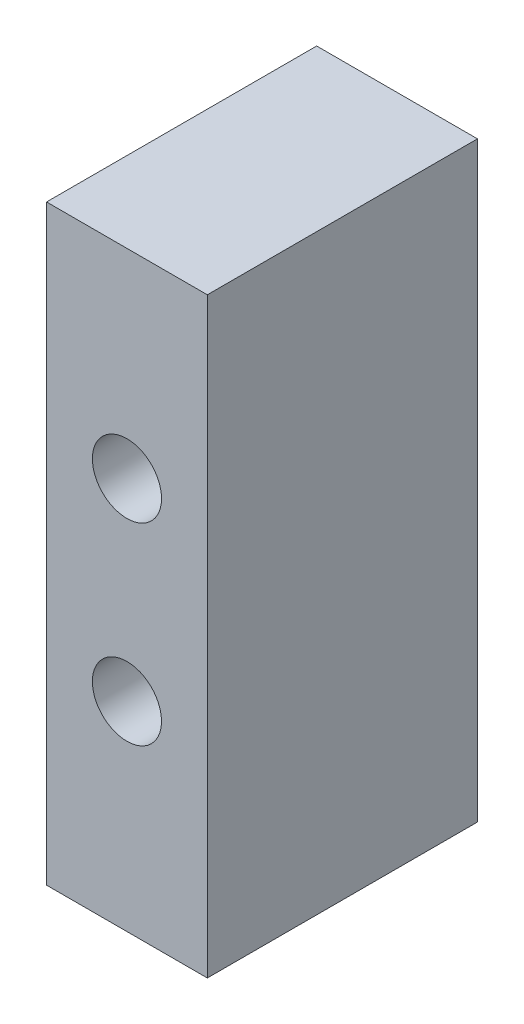
ISO-10303-21;
HEADER;
FILE_DESCRIPTION(('STEP AP214'),'2;1');
FILE_NAME('part.step','',(''),(''),'','','');
FILE_SCHEMA(('AUTOMOTIVE_DESIGN { 1 0 10303 214 1 1 1 1 }'));
ENDSEC;
DATA;
#1=APPLICATION_CONTEXT('core data for automotive mechanical design processes');
#2=APPLICATION_PROTOCOL_DEFINITION('international standard','automotive_design',2000,#1);
#3=PRODUCT_CONTEXT('',#1,'mechanical');
#4=PRODUCT('Part','Part','',(#3));
#5=PRODUCT_RELATED_PRODUCT_CATEGORY('part','',(#4));
#6=PRODUCT_DEFINITION_FORMATION('','',#4);
#7=PRODUCT_DEFINITION_CONTEXT('part definition',#1,'design');
#8=PRODUCT_DEFINITION('design','',#6,#7);
#9=PRODUCT_DEFINITION_SHAPE('','',#8);
#10=(LENGTH_UNIT() NAMED_UNIT(*) SI_UNIT(.MILLI.,.METRE.));
#11=(NAMED_UNIT(*) PLANE_ANGLE_UNIT() SI_UNIT($,.RADIAN.));
#12=(NAMED_UNIT(*) SI_UNIT($,.STERADIAN.) SOLID_ANGLE_UNIT());
#13=UNCERTAINTY_MEASURE_WITH_UNIT(LENGTH_MEASURE(1.E-05),#10,'distance_accuracy_value','');
#14=(GEOMETRIC_REPRESENTATION_CONTEXT(3) GLOBAL_UNCERTAINTY_ASSIGNED_CONTEXT((#13)) GLOBAL_UNIT_ASSIGNED_CONTEXT((#10,
#11,#12)) REPRESENTATION_CONTEXT('',''));
#15=CARTESIAN_POINT('',(0.,0.,0.));
#16=DIRECTION('',(0.,0.,1.));
#17=DIRECTION('',(1.,0.,0.));
#18=AXIS2_PLACEMENT_3D('',#15,#16,#17);
#19=CARTESIAN_POINT('',(0.,0.,16.8));
#20=DIRECTION('',(0.,0.,1.));
#21=DIRECTION('',(1.,0.,0.));
#22=AXIS2_PLACEMENT_3D('',#19,#20,#21);
#23=PLANE('',#22);
#24=CARTESIAN_POINT('',(0.,6.,16.8));
#25=DIRECTION('',(0.,0.,1.));
#26=DIRECTION('',(1.,0.,0.));
#27=AXIS2_PLACEMENT_3D('',#24,#25,#26);
#28=CIRCLE('',#27,2.15);
#29=CARTESIAN_POINT('',(2.15,6.,16.8));
#30=VERTEX_POINT('',#29);
#31=EDGE_CURVE('E116',#30,#30,#28,.T.);
#32=ORIENTED_EDGE('',*,*,#31,.F.);
#33=EDGE_LOOP('',(#32));
#34=FACE_BOUND('',#33,.T.);
#35=DIRECTION('',(0.,1.,0.));
#36=VECTOR('',#35,1.);
#37=CARTESIAN_POINT('',(5.,18.4,16.8));
#38=LINE('',#37,#36);
#39=CARTESIAN_POINT('',(5.,-18.4,16.8));
#40=VERTEX_POINT('',#39);
#41=CARTESIAN_POINT('',(5.,18.4,16.8));
#42=VERTEX_POINT('',#41);
#43=EDGE_CURVE('E96',#40,#42,#38,.T.);
#44=ORIENTED_EDGE('',*,*,#43,.T.);
#45=DIRECTION('',(-1.,0.,0.));
#46=VECTOR('',#45,1.);
#47=CARTESIAN_POINT('',(-5.,18.4,16.8));
#48=LINE('',#47,#46);
#49=CARTESIAN_POINT('',(-5.,18.4,16.8));
#50=VERTEX_POINT('',#49);
#51=EDGE_CURVE('E91',#42,#50,#48,.T.);
#52=ORIENTED_EDGE('',*,*,#51,.T.);
#53=DIRECTION('',(0.,-1.,0.));
#54=VECTOR('',#53,1.);
#55=CARTESIAN_POINT('',(-5.,18.4,16.8));
#56=LINE('',#55,#54);
#57=CARTESIAN_POINT('',(-5.,-18.4,16.8));
#58=VERTEX_POINT('',#57);
#59=EDGE_CURVE('E94',#50,#58,#56,.T.);
#60=ORIENTED_EDGE('',*,*,#59,.T.);
#61=DIRECTION('',(1.,0.,0.));
#62=VECTOR('',#61,1.);
#63=CARTESIAN_POINT('',(-5.,-18.4,16.8));
#64=LINE('',#63,#62);
#65=EDGE_CURVE('E61',#58,#40,#64,.T.);
#66=ORIENTED_EDGE('',*,*,#65,.T.);
#67=EDGE_LOOP('',(#44,#52,#60,#66));
#68=FACE_BOUND('',#67,.T.);
#69=CARTESIAN_POINT('',(0.,-6.,16.8));
#70=DIRECTION('',(0.,0.,1.));
#71=DIRECTION('',(-1.,0.,0.));
#72=AXIS2_PLACEMENT_3D('',#69,#70,#71);
#73=CIRCLE('',#72,2.15);
#74=CARTESIAN_POINT('',(-2.15,-6.,16.8));
#75=VERTEX_POINT('',#74);
#76=EDGE_CURVE('E138',#75,#75,#73,.T.);
#77=ORIENTED_EDGE('',*,*,#76,.F.);
#78=EDGE_LOOP('',(#77));
#79=FACE_BOUND('',#78,.T.);
#80=ADVANCED_FACE('F43',(#34,#68,#79),#23,.T.);
#81=CARTESIAN_POINT('',(0.,0.,0.));
#82=DIRECTION('',(0.,0.,1.));
#83=DIRECTION('',(1.,0.,0.));
#84=AXIS2_PLACEMENT_3D('',#81,#82,#83);
#85=PLANE('',#84);
#86=DIRECTION('',(0.,1.,0.));
#87=VECTOR('',#86,1.);
#88=CARTESIAN_POINT('',(5.,18.4,0.));
#89=LINE('',#88,#87);
#90=CARTESIAN_POINT('',(5.,-18.4,0.));
#91=VERTEX_POINT('',#90);
#92=CARTESIAN_POINT('',(5.,18.4,0.));
#93=VERTEX_POINT('',#92);
#94=EDGE_CURVE('E112',#91,#93,#89,.T.);
#95=ORIENTED_EDGE('',*,*,#94,.F.);
#96=DIRECTION('',(1.,0.,0.));
#97=VECTOR('',#96,1.);
#98=CARTESIAN_POINT('',(-5.,-18.4,0.));
#99=LINE('',#98,#97);
#100=CARTESIAN_POINT('',(-5.,-18.4,0.));
#101=VERTEX_POINT('',#100);
#102=EDGE_CURVE('E84',#101,#91,#99,.T.);
#103=ORIENTED_EDGE('',*,*,#102,.F.);
#104=DIRECTION('',(0.,-1.,0.));
#105=VECTOR('',#104,1.);
#106=CARTESIAN_POINT('',(-5.,18.4,0.));
#107=LINE('',#106,#105);
#108=CARTESIAN_POINT('',(-5.,18.4,0.));
#109=VERTEX_POINT('',#108);
#110=EDGE_CURVE('E78',#109,#101,#107,.T.);
#111=ORIENTED_EDGE('',*,*,#110,.F.);
#112=DIRECTION('',(-1.,0.,0.));
#113=VECTOR('',#112,1.);
#114=CARTESIAN_POINT('',(-5.,18.4,0.));
#115=LINE('',#114,#113);
#116=EDGE_CURVE('E101',#93,#109,#115,.T.);
#117=ORIENTED_EDGE('',*,*,#116,.F.);
#118=EDGE_LOOP('',(#95,#103,#111,#117));
#119=FACE_BOUND('',#118,.T.);
#120=CARTESIAN_POINT('',(0.,6.,0.));
#121=DIRECTION('',(0.,0.,1.));
#122=DIRECTION('',(1.,0.,0.));
#123=AXIS2_PLACEMENT_3D('',#120,#121,#122);
#124=CIRCLE('',#123,2.15);
#125=CARTESIAN_POINT('',(2.15,6.,0.));
#126=VERTEX_POINT('',#125);
#127=EDGE_CURVE('E134',#126,#126,#124,.T.);
#128=ORIENTED_EDGE('',*,*,#127,.T.);
#129=EDGE_LOOP('',(#128));
#130=FACE_BOUND('',#129,.T.);
#131=CARTESIAN_POINT('',(0.,-6.,0.));
#132=DIRECTION('',(0.,0.,1.));
#133=DIRECTION('',(-1.,0.,0.));
#134=AXIS2_PLACEMENT_3D('',#131,#132,#133);
#135=CIRCLE('',#134,2.15);
#136=CARTESIAN_POINT('',(-2.15,-6.,0.));
#137=VERTEX_POINT('',#136);
#138=EDGE_CURVE('E142',#137,#137,#135,.T.);
#139=ORIENTED_EDGE('',*,*,#138,.T.);
#140=EDGE_LOOP('',(#139));
#141=FACE_BOUND('',#140,.T.);
#142=ADVANCED_FACE('F129',(#119,#130,#141),#85,.F.);
#143=CARTESIAN_POINT('',(5.,18.4,16.8));
#144=DIRECTION('',(-1.,0.,0.));
#145=DIRECTION('',(0.,-1.,0.));
#146=AXIS2_PLACEMENT_3D('',#143,#144,#145);
#147=PLANE('',#146);
#148=ORIENTED_EDGE('',*,*,#94,.T.);
#149=DIRECTION('',(0.,0.,-1.));
#150=VECTOR('',#149,1.);
#151=CARTESIAN_POINT('',(5.,18.4,16.8));
#152=LINE('',#151,#150);
#153=EDGE_CURVE('E11',#42,#93,#152,.T.);
#154=ORIENTED_EDGE('',*,*,#153,.F.);
#155=ORIENTED_EDGE('',*,*,#43,.F.);
#156=DIRECTION('',(0.,0.,-1.));
#157=VECTOR('',#156,1.);
#158=CARTESIAN_POINT('',(5.,-18.4,16.8));
#159=LINE('',#158,#157);
#160=EDGE_CURVE('E108',#40,#91,#159,.T.);
#161=ORIENTED_EDGE('',*,*,#160,.T.);
#162=EDGE_LOOP('',(#148,#154,#155,#161));
#163=FACE_BOUND('',#162,.T.);
#164=ADVANCED_FACE('F45',(#163),#147,.F.);
#165=CARTESIAN_POINT('',(-5.,18.4,16.8));
#166=DIRECTION('',(0.,-1.,0.));
#167=DIRECTION('',(0.,0.,-1.));
#168=AXIS2_PLACEMENT_3D('',#165,#166,#167);
#169=PLANE('',#168);
#170=ORIENTED_EDGE('',*,*,#116,.T.);
#171=DIRECTION('',(0.,0.,-1.));
#172=VECTOR('',#171,1.);
#173=CARTESIAN_POINT('',(-5.,18.4,16.8));
#174=LINE('',#173,#172);
#175=EDGE_CURVE('E53',#50,#109,#174,.T.);
#176=ORIENTED_EDGE('',*,*,#175,.F.);
#177=ORIENTED_EDGE('',*,*,#51,.F.);
#178=ORIENTED_EDGE('',*,*,#153,.T.);
#179=EDGE_LOOP('',(#170,#176,#177,#178));
#180=FACE_BOUND('',#179,.T.);
#181=ADVANCED_FACE('F100',(#180),#169,.F.);
#182=CARTESIAN_POINT('',(-5.,18.4,16.8));
#183=DIRECTION('',(1.,0.,0.));
#184=DIRECTION('',(0.,1.,0.));
#185=AXIS2_PLACEMENT_3D('',#182,#183,#184);
#186=PLANE('',#185);
#187=ORIENTED_EDGE('',*,*,#110,.T.);
#188=DIRECTION('',(0.,0.,-1.));
#189=VECTOR('',#188,1.);
#190=CARTESIAN_POINT('',(-5.,-18.4,16.8));
#191=LINE('',#190,#189);
#192=EDGE_CURVE('E103',#58,#101,#191,.T.);
#193=ORIENTED_EDGE('',*,*,#192,.F.);
#194=ORIENTED_EDGE('',*,*,#59,.F.);
#195=ORIENTED_EDGE('',*,*,#175,.T.);
#196=EDGE_LOOP('',(#187,#193,#194,#195));
#197=FACE_BOUND('',#196,.T.);
#198=ADVANCED_FACE('F104',(#197),#186,.F.);
#199=CARTESIAN_POINT('',(-5.,-18.4,16.8));
#200=DIRECTION('',(0.,1.,0.));
#201=DIRECTION('',(0.,0.,1.));
#202=AXIS2_PLACEMENT_3D('',#199,#200,#201);
#203=PLANE('',#202);
#204=ORIENTED_EDGE('',*,*,#102,.T.);
#205=ORIENTED_EDGE('',*,*,#160,.F.);
#206=ORIENTED_EDGE('',*,*,#65,.F.);
#207=ORIENTED_EDGE('',*,*,#192,.T.);
#208=EDGE_LOOP('',(#204,#205,#206,#207));
#209=FACE_BOUND('',#208,.T.);
#210=ADVANCED_FACE('F126',(#209),#203,.F.);
#211=CARTESIAN_POINT('',(0.,6.,16.8));
#212=DIRECTION('',(0.,0.,-1.));
#213=DIRECTION('',(-1.,0.,0.));
#214=AXIS2_PLACEMENT_3D('',#211,#212,#213);
#215=CYLINDRICAL_SURFACE('',#214,2.15);
#216=ORIENTED_EDGE('',*,*,#31,.T.);
#217=EDGE_LOOP('',(#216));
#218=FACE_BOUND('',#217,.T.);
#219=ORIENTED_EDGE('',*,*,#127,.F.);
#220=EDGE_LOOP('',(#219));
#221=FACE_BOUND('',#220,.T.);
#222=ADVANCED_FACE('F161',(#218,#221),#215,.F.);
#223=CARTESIAN_POINT('',(0.,-6.,16.8));
#224=DIRECTION('',(0.,0.,-1.));
#225=DIRECTION('',(-1.,0.,0.));
#226=AXIS2_PLACEMENT_3D('',#223,#224,#225);
#227=CYLINDRICAL_SURFACE('',#226,2.15);
#228=ORIENTED_EDGE('',*,*,#76,.T.);
#229=EDGE_LOOP('',(#228));
#230=FACE_BOUND('',#229,.T.);
#231=ORIENTED_EDGE('',*,*,#138,.F.);
#232=EDGE_LOOP('',(#231));
#233=FACE_BOUND('',#232,.T.);
#234=ADVANCED_FACE('F150',(#230,#233),#227,.F.);
#235=CLOSED_SHELL('',(#80,#142,#164,#181,#198,#210,#222,#234));
#236=MANIFOLD_SOLID_BREP('B2',#235);
#237=ADVANCED_BREP_SHAPE_REPRESENTATION('',(#18,#236),#14);
#238=SHAPE_DEFINITION_REPRESENTATION(#9,#237);
ENDSEC;
END-ISO-10303-21;
